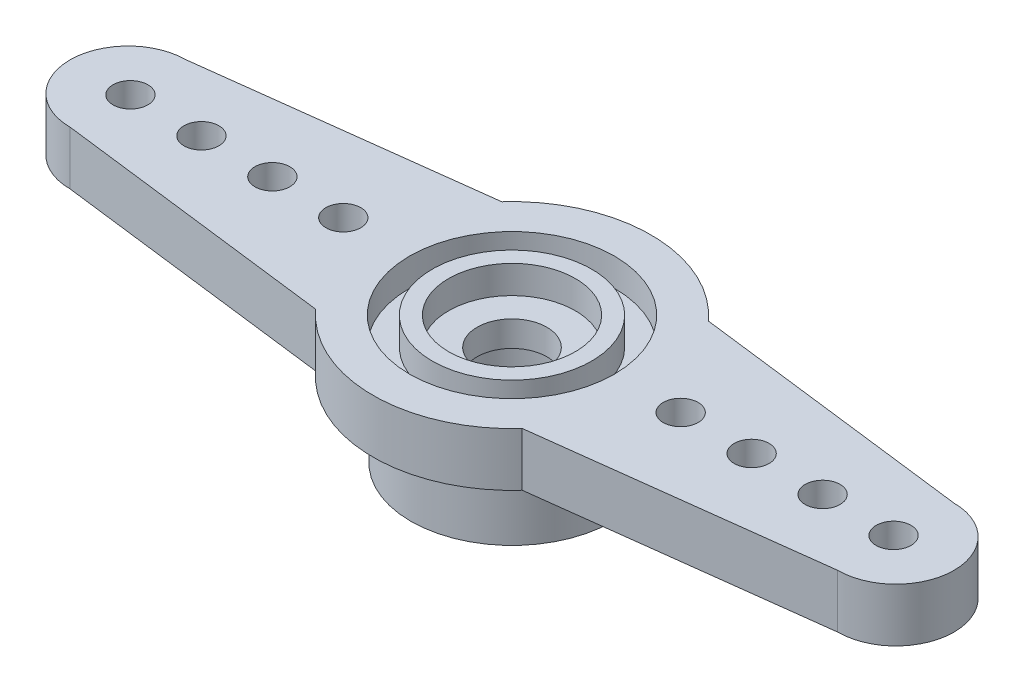
ISO-10303-21;
HEADER;
FILE_DESCRIPTION(('STEP AP214'),'2;1');
FILE_NAME('part.step','',(''),(''),'','','');
FILE_SCHEMA(('AUTOMOTIVE_DESIGN { 1 0 10303 214 1 1 1 1 }'));
ENDSEC;
DATA;
#1=APPLICATION_CONTEXT('core data for automotive mechanical design processes');
#2=APPLICATION_PROTOCOL_DEFINITION('international standard','automotive_design',2000,#1);
#3=PRODUCT_CONTEXT('',#1,'mechanical');
#4=PRODUCT('Part','Part','',(#3));
#5=PRODUCT_RELATED_PRODUCT_CATEGORY('part','',(#4));
#6=PRODUCT_DEFINITION_FORMATION('','',#4);
#7=PRODUCT_DEFINITION_CONTEXT('part definition',#1,'design');
#8=PRODUCT_DEFINITION('design','',#6,#7);
#9=PRODUCT_DEFINITION_SHAPE('','',#8);
#10=(LENGTH_UNIT() NAMED_UNIT(*) SI_UNIT(.MILLI.,.METRE.));
#11=(NAMED_UNIT(*) PLANE_ANGLE_UNIT() SI_UNIT($,.RADIAN.));
#12=(NAMED_UNIT(*) SI_UNIT($,.STERADIAN.) SOLID_ANGLE_UNIT());
#13=UNCERTAINTY_MEASURE_WITH_UNIT(LENGTH_MEASURE(1.E-05),#10,'distance_accuracy_value','');
#14=(GEOMETRIC_REPRESENTATION_CONTEXT(3) GLOBAL_UNCERTAINTY_ASSIGNED_CONTEXT((#13)) GLOBAL_UNIT_ASSIGNED_CONTEXT((#10,
#11,#12)) REPRESENTATION_CONTEXT('',''));
#15=CARTESIAN_POINT('',(0.,0.,0.));
#16=DIRECTION('',(0.,0.,1.));
#17=DIRECTION('',(1.,0.,0.));
#18=AXIS2_PLACEMENT_3D('',#15,#16,#17);
#19=CARTESIAN_POINT('',(0.,2.3,0.));
#20=DIRECTION('',(0.,-1.,0.));
#21=DIRECTION('',(0.,0.,-1.));
#22=AXIS2_PLACEMENT_3D('',#19,#20,#21);
#23=CYLINDRICAL_SURFACE('',#22,1.5);
#24=CARTESIAN_POINT('',(0.,0.,0.));
#25=DIRECTION('',(0.,1.,0.));
#26=DIRECTION('',(0.,0.,1.));
#27=AXIS2_PLACEMENT_3D('',#24,#25,#26);
#28=CIRCLE('',#27,1.5);
#29=CARTESIAN_POINT('',(0.,0.,1.5));
#30=VERTEX_POINT('',#29);
#31=EDGE_CURVE('E145',#30,#30,#28,.T.);
#32=ORIENTED_EDGE('',*,*,#31,.F.);
#33=EDGE_LOOP('',(#32));
#34=FACE_BOUND('',#33,.T.);
#35=CARTESIAN_POINT('',(0.,1.1,0.));
#36=DIRECTION('',(0.,1.,0.));
#37=DIRECTION('',(0.,0.,1.));
#38=AXIS2_PLACEMENT_3D('',#35,#36,#37);
#39=CIRCLE('',#38,1.5);
#40=CARTESIAN_POINT('',(0.,1.1,1.5));
#41=VERTEX_POINT('',#40);
#42=EDGE_CURVE('E269',#41,#41,#39,.F.);
#43=ORIENTED_EDGE('',*,*,#42,.F.);
#44=EDGE_LOOP('',(#43));
#45=FACE_BOUND('',#44,.T.);
#46=ADVANCED_FACE('F42',(#34,#45),#23,.F.);
#47=CARTESIAN_POINT('',(0.,2.3,0.));
#48=DIRECTION('',(0.,1.,0.));
#49=DIRECTION('',(0.,0.,1.));
#50=AXIS2_PLACEMENT_3D('',#47,#48,#49);
#51=PLANE('',#50);
#52=CARTESIAN_POINT('',(0.,2.3,0.));
#53=DIRECTION('',(0.,1.,0.));
#54=DIRECTION('',(0.,0.,1.));
#55=AXIS2_PLACEMENT_3D('',#52,#53,#54);
#56=CIRCLE('',#55,2.725);
#57=CARTESIAN_POINT('',(0.,2.3,2.725));
#58=VERTEX_POINT('',#57);
#59=EDGE_CURVE('E266',#58,#58,#56,.T.);
#60=ORIENTED_EDGE('',*,*,#59,.F.);
#61=EDGE_LOOP('',(#60));
#62=FACE_BOUND('',#61,.T.);
#63=CARTESIAN_POINT('',(0.,2.3,0.));
#64=DIRECTION('',(0.,1.,0.));
#65=DIRECTION('',(0.,0.,1.));
#66=AXIS2_PLACEMENT_3D('',#63,#64,#65);
#67=CIRCLE('',#66,3.425);
#68=CARTESIAN_POINT('',(0.,2.3,3.425));
#69=VERTEX_POINT('',#68);
#70=EDGE_CURVE('E258',#69,#69,#67,.T.);
#71=ORIENTED_EDGE('',*,*,#70,.T.);
#72=EDGE_LOOP('',(#71));
#73=FACE_BOUND('',#72,.T.);
#74=ADVANCED_FACE('F279',(#62,#73),#51,.T.);
#75=CARTESIAN_POINT('',(0.,0.,0.));
#76=DIRECTION('',(0.,1.,0.));
#77=DIRECTION('',(0.,0.,1.));
#78=AXIS2_PLACEMENT_3D('',#75,#76,#77);
#79=PLANE('',#78);
#80=CARTESIAN_POINT('',(7.25,0.,0.));
#81=DIRECTION('',(0.,1.,0.));
#82=DIRECTION('',(0.,0.,1.));
#83=AXIS2_PLACEMENT_3D('',#80,#81,#82);
#84=CIRCLE('',#83,0.75);
#85=CARTESIAN_POINT('',(7.25,0.,0.75));
#86=VERTEX_POINT('',#85);
#87=EDGE_CURVE('E233',#86,#86,#84,.T.);
#88=ORIENTED_EDGE('',*,*,#87,.T.);
#89=EDGE_LOOP('',(#88));
#90=FACE_BOUND('',#89,.T.);
#91=CARTESIAN_POINT('',(-13.35,0.,0.));
#92=DIRECTION('',(0.,1.,0.));
#93=DIRECTION('',(0.,0.,1.));
#94=AXIS2_PLACEMENT_3D('',#91,#92,#93);
#95=CIRCLE('',#94,0.75);
#96=CARTESIAN_POINT('',(-13.35,0.,0.75));
#97=VERTEX_POINT('',#96);
#98=EDGE_CURVE('E221',#97,#97,#95,.T.);
#99=ORIENTED_EDGE('',*,*,#98,.T.);
#100=EDGE_LOOP('',(#99));
#101=FACE_BOUND('',#100,.T.);
#102=CARTESIAN_POINT('',(16.4,0.,0.));
#103=DIRECTION('',(0.,1.,0.));
#104=DIRECTION('',(0.,0.,1.));
#105=AXIS2_PLACEMENT_3D('',#102,#103,#104);
#106=CIRCLE('',#105,0.750000000000002);
#107=CARTESIAN_POINT('',(16.4,0.,0.750000000000002));
#108=VERTEX_POINT('',#107);
#109=EDGE_CURVE('E209',#108,#108,#106,.T.);
#110=ORIENTED_EDGE('',*,*,#109,.T.);
#111=EDGE_LOOP('',(#110));
#112=FACE_BOUND('',#111,.T.);
#113=CARTESIAN_POINT('',(10.3,0.,0.));
#114=DIRECTION('',(0.,1.,0.));
#115=DIRECTION('',(0.,0.,1.));
#116=AXIS2_PLACEMENT_3D('',#113,#114,#115);
#117=CIRCLE('',#116,0.75);
#118=CARTESIAN_POINT('',(10.3,0.,0.75));
#119=VERTEX_POINT('',#118);
#120=EDGE_CURVE('E197',#119,#119,#117,.T.);
#121=ORIENTED_EDGE('',*,*,#120,.T.);
#122=EDGE_LOOP('',(#121));
#123=FACE_BOUND('',#122,.T.);
#124=CARTESIAN_POINT('',(0.,0.,0.));
#125=DIRECTION('',(0.,1.,0.));
#126=DIRECTION('',(0.,0.,1.));
#127=AXIS2_PLACEMENT_3D('',#124,#125,#126);
#128=CIRCLE('',#127,5.975);
#129=CARTESIAN_POINT('',(4.4385386108493,0.,-4.));
#130=VERTEX_POINT('',#129);
#131=CARTESIAN_POINT('',(-4.4385386108493,0.,-4.));
#132=VERTEX_POINT('',#131);
#133=EDGE_CURVE('E141',#130,#132,#128,.T.);
#134=ORIENTED_EDGE('',*,*,#133,.F.);
#135=DIRECTION('',(-0.992355477372928,0.,-0.123412343499133));
#136=VECTOR('',#135,1.);
#137=CARTESIAN_POINT('',(4.4385386108493,0.,-4.));
#138=LINE('',#137,#136);
#139=CARTESIAN_POINT('',(16.5,0.,-2.5));
#140=VERTEX_POINT('',#139);
#141=EDGE_CURVE('E94',#140,#130,#138,.T.);
#142=ORIENTED_EDGE('',*,*,#141,.F.);
#143=CARTESIAN_POINT('',(16.5,0.,0.));
#144=DIRECTION('',(0.,1.,0.));
#145=DIRECTION('',(0.,0.,1.));
#146=AXIS2_PLACEMENT_3D('',#143,#144,#145);
#147=CIRCLE('',#146,2.5);
#148=CARTESIAN_POINT('',(16.5,0.,2.5));
#149=VERTEX_POINT('',#148);
#150=EDGE_CURVE('E88',#149,#140,#147,.T.);
#151=ORIENTED_EDGE('',*,*,#150,.F.);
#152=DIRECTION('',(0.992355477372928,0.,-0.123412343499133));
#153=VECTOR('',#152,1.);
#154=CARTESIAN_POINT('',(4.4385386108493,0.,4.));
#155=LINE('',#154,#153);
#156=CARTESIAN_POINT('',(4.4385386108493,0.,4.));
#157=VERTEX_POINT('',#156);
#158=EDGE_CURVE('E131',#157,#149,#155,.T.);
#159=ORIENTED_EDGE('',*,*,#158,.F.);
#160=CARTESIAN_POINT('',(0.,0.,0.));
#161=DIRECTION('',(0.,1.,0.));
#162=DIRECTION('',(0.,0.,1.));
#163=AXIS2_PLACEMENT_3D('',#160,#161,#162);
#164=CIRCLE('',#163,5.975);
#165=CARTESIAN_POINT('',(-4.43853861084929,0.,4.));
#166=VERTEX_POINT('',#165);
#167=EDGE_CURVE('E151',#166,#157,#164,.T.);
#168=ORIENTED_EDGE('',*,*,#167,.F.);
#169=DIRECTION('',(0.992355477372928,0.,0.123412343499133));
#170=VECTOR('',#169,1.);
#171=CARTESIAN_POINT('',(-16.5,0.,2.5));
#172=LINE('',#171,#170);
#173=CARTESIAN_POINT('',(-16.5,0.,2.5));
#174=VERTEX_POINT('',#173);
#175=EDGE_CURVE('E149',#174,#166,#172,.T.);
#176=ORIENTED_EDGE('',*,*,#175,.F.);
#177=CARTESIAN_POINT('',(-16.5,0.,0.));
#178=DIRECTION('',(0.,1.,0.));
#179=DIRECTION('',(0.,0.,1.));
#180=AXIS2_PLACEMENT_3D('',#177,#178,#179);
#181=CIRCLE('',#180,2.5);
#182=CARTESIAN_POINT('',(-16.5,0.,-2.5));
#183=VERTEX_POINT('',#182);
#184=EDGE_CURVE('E147',#183,#174,#181,.T.);
#185=ORIENTED_EDGE('',*,*,#184,.F.);
#186=DIRECTION('',(-0.992355477372928,0.,0.123412343499133));
#187=VECTOR('',#186,1.);
#188=CARTESIAN_POINT('',(-4.4385386108493,0.,-4.));
#189=LINE('',#188,#187);
#190=EDGE_CURVE('E144',#132,#183,#189,.T.);
#191=ORIENTED_EDGE('',*,*,#190,.F.);
#192=EDGE_LOOP('',(#134,#142,#151,#159,#168,#176,#185,#191));
#193=FACE_BOUND('',#192,.T.);
#194=CARTESIAN_POINT('',(13.35,0.,0.));
#195=DIRECTION('',(0.,1.,0.));
#196=DIRECTION('',(0.,0.,1.));
#197=AXIS2_PLACEMENT_3D('',#194,#195,#196);
#198=CIRCLE('',#197,0.75);
#199=CARTESIAN_POINT('',(13.35,0.,0.75));
#200=VERTEX_POINT('',#199);
#201=EDGE_CURVE('E203',#200,#200,#198,.T.);
#202=ORIENTED_EDGE('',*,*,#201,.T.);
#203=EDGE_LOOP('',(#202));
#204=FACE_BOUND('',#203,.T.);
#205=CARTESIAN_POINT('',(-10.3,0.,0.));
#206=DIRECTION('',(0.,1.,0.));
#207=DIRECTION('',(0.,0.,1.));
#208=AXIS2_PLACEMENT_3D('',#205,#206,#207);
#209=CIRCLE('',#208,0.75);
#210=CARTESIAN_POINT('',(-10.3,0.,0.75));
#211=VERTEX_POINT('',#210);
#212=EDGE_CURVE('E215',#211,#211,#209,.T.);
#213=ORIENTED_EDGE('',*,*,#212,.T.);
#214=EDGE_LOOP('',(#213));
#215=FACE_BOUND('',#214,.T.);
#216=CARTESIAN_POINT('',(-16.4,0.,0.));
#217=DIRECTION('',(0.,1.,0.));
#218=DIRECTION('',(0.,0.,1.));
#219=AXIS2_PLACEMENT_3D('',#216,#217,#218);
#220=CIRCLE('',#219,0.750000000000002);
#221=CARTESIAN_POINT('',(-16.4,0.,0.750000000000004));
#222=VERTEX_POINT('',#221);
#223=EDGE_CURVE('E227',#222,#222,#220,.T.);
#224=ORIENTED_EDGE('',*,*,#223,.T.);
#225=EDGE_LOOP('',(#224));
#226=FACE_BOUND('',#225,.T.);
#227=CARTESIAN_POINT('',(-7.25,0.,0.));
#228=DIRECTION('',(0.,1.,0.));
#229=DIRECTION('',(0.,0.,1.));
#230=AXIS2_PLACEMENT_3D('',#227,#228,#229);
#231=CIRCLE('',#230,0.75);
#232=CARTESIAN_POINT('',(-7.25,0.,0.75));
#233=VERTEX_POINT('',#232);
#234=EDGE_CURVE('E239',#233,#233,#231,.T.);
#235=ORIENTED_EDGE('',*,*,#234,.T.);
#236=EDGE_LOOP('',(#235));
#237=FACE_BOUND('',#236,.T.);
#238=CARTESIAN_POINT('',(0.,0.,0.));
#239=DIRECTION('',(0.,1.,0.));
#240=DIRECTION('',(0.,0.,1.));
#241=AXIS2_PLACEMENT_3D('',#238,#239,#240);
#242=CIRCLE('',#241,4.35);
#243=CARTESIAN_POINT('',(0.,0.,4.35));
#244=VERTEX_POINT('',#243);
#245=EDGE_CURVE('E12',#244,#244,#242,.F.);
#246=ORIENTED_EDGE('',*,*,#245,.F.);
#247=EDGE_LOOP('',(#246));
#248=FACE_BOUND('',#247,.T.);
#249=ADVANCED_FACE('F174',(#90,#101,#112,#123,#193,#204,#215,#226,#237,#248),#79,.F.);
#250=CARTESIAN_POINT('',(0.,2.3,0.));
#251=DIRECTION('',(0.,1.,0.));
#252=DIRECTION('',(0.,0.,1.));
#253=AXIS2_PLACEMENT_3D('',#250,#251,#252);
#254=CIRCLE('',#253,4.4);
#255=CARTESIAN_POINT('',(0.,2.3,4.4));
#256=VERTEX_POINT('',#255);
#257=EDGE_CURVE('E254',#256,#256,#254,.T.);
#258=ORIENTED_EDGE('',*,*,#257,.F.);
#259=EDGE_LOOP('',(#258));
#260=FACE_BOUND('',#259,.T.);
#261=CARTESIAN_POINT('',(7.25,2.3,0.));
#262=DIRECTION('',(0.,1.,0.));
#263=DIRECTION('',(0.,0.,1.));
#264=AXIS2_PLACEMENT_3D('',#261,#262,#263);
#265=CIRCLE('',#264,0.75);
#266=CARTESIAN_POINT('',(7.25,2.3,0.75));
#267=VERTEX_POINT('',#266);
#268=EDGE_CURVE('E230',#267,#267,#265,.T.);
#269=ORIENTED_EDGE('',*,*,#268,.F.);
#270=EDGE_LOOP('',(#269));
#271=FACE_BOUND('',#270,.T.);
#272=CARTESIAN_POINT('',(-13.35,2.3,0.));
#273=DIRECTION('',(0.,1.,0.));
#274=DIRECTION('',(0.,0.,1.));
#275=AXIS2_PLACEMENT_3D('',#272,#273,#274);
#276=CIRCLE('',#275,0.75);
#277=CARTESIAN_POINT('',(-13.35,2.3,0.75));
#278=VERTEX_POINT('',#277);
#279=EDGE_CURVE('E218',#278,#278,#276,.T.);
#280=ORIENTED_EDGE('',*,*,#279,.F.);
#281=EDGE_LOOP('',(#280));
#282=FACE_BOUND('',#281,.T.);
#283=CARTESIAN_POINT('',(16.4,2.3,0.));
#284=DIRECTION('',(0.,1.,0.));
#285=DIRECTION('',(0.,0.,1.));
#286=AXIS2_PLACEMENT_3D('',#283,#284,#285);
#287=CIRCLE('',#286,0.750000000000002);
#288=CARTESIAN_POINT('',(16.4,2.3,0.750000000000002));
#289=VERTEX_POINT('',#288);
#290=EDGE_CURVE('E206',#289,#289,#287,.T.);
#291=ORIENTED_EDGE('',*,*,#290,.F.);
#292=EDGE_LOOP('',(#291));
#293=FACE_BOUND('',#292,.T.);
#294=CARTESIAN_POINT('',(10.3,2.3,0.));
#295=DIRECTION('',(0.,1.,0.));
#296=DIRECTION('',(0.,0.,1.));
#297=AXIS2_PLACEMENT_3D('',#294,#295,#296);
#298=CIRCLE('',#297,0.75);
#299=CARTESIAN_POINT('',(10.3,2.3,0.75));
#300=VERTEX_POINT('',#299);
#301=EDGE_CURVE('E196',#300,#300,#298,.T.);
#302=ORIENTED_EDGE('',*,*,#301,.F.);
#303=EDGE_LOOP('',(#302));
#304=FACE_BOUND('',#303,.T.);
#305=CARTESIAN_POINT('',(0.,2.3,0.));
#306=DIRECTION('',(0.,1.,0.));
#307=DIRECTION('',(0.,0.,1.));
#308=AXIS2_PLACEMENT_3D('',#305,#306,#307);
#309=CIRCLE('',#308,5.975);
#310=CARTESIAN_POINT('',(4.4385386108493,2.3,-4.));
#311=VERTEX_POINT('',#310);
#312=CARTESIAN_POINT('',(-4.4385386108493,2.3,-4.));
#313=VERTEX_POINT('',#312);
#314=EDGE_CURVE('E156',#311,#313,#309,.T.);
#315=ORIENTED_EDGE('',*,*,#314,.T.);
#316=DIRECTION('',(-0.992355477372928,0.,0.123412343499133));
#317=VECTOR('',#316,1.);
#318=CARTESIAN_POINT('',(-4.4385386108493,2.3,-4.));
#319=LINE('',#318,#317);
#320=CARTESIAN_POINT('',(-16.5,2.3,-2.5));
#321=VERTEX_POINT('',#320);
#322=EDGE_CURVE('E103',#313,#321,#319,.T.);
#323=ORIENTED_EDGE('',*,*,#322,.T.);
#324=CARTESIAN_POINT('',(-16.5,2.3,0.));
#325=DIRECTION('',(0.,1.,0.));
#326=DIRECTION('',(0.,0.,1.));
#327=AXIS2_PLACEMENT_3D('',#324,#325,#326);
#328=CIRCLE('',#327,2.5);
#329=CARTESIAN_POINT('',(-16.5,2.3,2.5));
#330=VERTEX_POINT('',#329);
#331=EDGE_CURVE('E188',#321,#330,#328,.T.);
#332=ORIENTED_EDGE('',*,*,#331,.T.);
#333=DIRECTION('',(0.992355477372928,0.,0.123412343499133));
#334=VECTOR('',#333,1.);
#335=CARTESIAN_POINT('',(-16.5,2.3,2.5));
#336=LINE('',#335,#334);
#337=CARTESIAN_POINT('',(-4.43853861084929,2.3,4.));
#338=VERTEX_POINT('',#337);
#339=EDGE_CURVE('E187',#330,#338,#336,.T.);
#340=ORIENTED_EDGE('',*,*,#339,.T.);
#341=CARTESIAN_POINT('',(0.,2.3,0.));
#342=DIRECTION('',(0.,1.,0.));
#343=DIRECTION('',(0.,0.,1.));
#344=AXIS2_PLACEMENT_3D('',#341,#342,#343);
#345=CIRCLE('',#344,5.975);
#346=CARTESIAN_POINT('',(4.4385386108493,2.3,4.));
#347=VERTEX_POINT('',#346);
#348=EDGE_CURVE('E123',#338,#347,#345,.T.);
#349=ORIENTED_EDGE('',*,*,#348,.T.);
#350=DIRECTION('',(0.992355477372928,0.,-0.123412343499133));
#351=VECTOR('',#350,1.);
#352=CARTESIAN_POINT('',(4.4385386108493,2.3,4.));
#353=LINE('',#352,#351);
#354=CARTESIAN_POINT('',(16.5,2.3,2.5));
#355=VERTEX_POINT('',#354);
#356=EDGE_CURVE('E116',#347,#355,#353,.T.);
#357=ORIENTED_EDGE('',*,*,#356,.T.);
#358=CARTESIAN_POINT('',(16.5,2.3,0.));
#359=DIRECTION('',(0.,1.,0.));
#360=DIRECTION('',(0.,0.,1.));
#361=AXIS2_PLACEMENT_3D('',#358,#359,#360);
#362=CIRCLE('',#361,2.5);
#363=CARTESIAN_POINT('',(16.5,2.3,-2.5));
#364=VERTEX_POINT('',#363);
#365=EDGE_CURVE('E121',#355,#364,#362,.T.);
#366=ORIENTED_EDGE('',*,*,#365,.T.);
#367=DIRECTION('',(-0.992355477372928,0.,-0.123412343499133));
#368=VECTOR('',#367,1.);
#369=CARTESIAN_POINT('',(4.4385386108493,2.3,-4.));
#370=LINE('',#369,#368);
#371=EDGE_CURVE('E59',#364,#311,#370,.T.);
#372=ORIENTED_EDGE('',*,*,#371,.T.);
#373=EDGE_LOOP('',(#315,#323,#332,#340,#349,#357,#366,#372));
#374=FACE_BOUND('',#373,.T.);
#375=CARTESIAN_POINT('',(13.35,2.3,0.));
#376=DIRECTION('',(0.,1.,0.));
#377=DIRECTION('',(0.,0.,1.));
#378=AXIS2_PLACEMENT_3D('',#375,#376,#377);
#379=CIRCLE('',#378,0.75);
#380=CARTESIAN_POINT('',(13.35,2.3,0.75));
#381=VERTEX_POINT('',#380);
#382=EDGE_CURVE('E200',#381,#381,#379,.T.);
#383=ORIENTED_EDGE('',*,*,#382,.F.);
#384=EDGE_LOOP('',(#383));
#385=FACE_BOUND('',#384,.T.);
#386=CARTESIAN_POINT('',(-10.3,2.3,0.));
#387=DIRECTION('',(0.,1.,0.));
#388=DIRECTION('',(0.,0.,1.));
#389=AXIS2_PLACEMENT_3D('',#386,#387,#388);
#390=CIRCLE('',#389,0.75);
#391=CARTESIAN_POINT('',(-10.3,2.3,0.75));
#392=VERTEX_POINT('',#391);
#393=EDGE_CURVE('E212',#392,#392,#390,.T.);
#394=ORIENTED_EDGE('',*,*,#393,.F.);
#395=EDGE_LOOP('',(#394));
#396=FACE_BOUND('',#395,.T.);
#397=CARTESIAN_POINT('',(-16.4,2.3,0.));
#398=DIRECTION('',(0.,1.,0.));
#399=DIRECTION('',(0.,0.,1.));
#400=AXIS2_PLACEMENT_3D('',#397,#398,#399);
#401=CIRCLE('',#400,0.750000000000002);
#402=CARTESIAN_POINT('',(-16.4,2.3,0.750000000000004));
#403=VERTEX_POINT('',#402);
#404=EDGE_CURVE('E224',#403,#403,#401,.T.);
#405=ORIENTED_EDGE('',*,*,#404,.F.);
#406=EDGE_LOOP('',(#405));
#407=FACE_BOUND('',#406,.T.);
#408=CARTESIAN_POINT('',(-7.25,2.3,0.));
#409=DIRECTION('',(0.,1.,0.));
#410=DIRECTION('',(0.,0.,1.));
#411=AXIS2_PLACEMENT_3D('',#408,#409,#410);
#412=CIRCLE('',#411,0.75);
#413=CARTESIAN_POINT('',(-7.25,2.3,0.75));
#414=VERTEX_POINT('',#413);
#415=EDGE_CURVE('E236',#414,#414,#412,.T.);
#416=ORIENTED_EDGE('',*,*,#415,.F.);
#417=EDGE_LOOP('',(#416));
#418=FACE_BOUND('',#417,.T.);
#419=ADVANCED_FACE('F118',(#260,#271,#282,#293,#304,#374,#385,#396,#407,#418),#51,.T.);
#420=CARTESIAN_POINT('',(0.,0.,0.));
#421=DIRECTION('',(0.,-1.,0.));
#422=DIRECTION('',(0.,0.,-1.));
#423=AXIS2_PLACEMENT_3D('',#420,#421,#422);
#424=CIRCLE('',#423,2.45);
#425=CARTESIAN_POINT('',(0.,0.,-2.45));
#426=VERTEX_POINT('',#425);
#427=EDGE_CURVE('E248',#426,#426,#424,.T.);
#428=ORIENTED_EDGE('',*,*,#427,.T.);
#429=EDGE_LOOP('',(#428));
#430=FACE_BOUND('',#429,.T.);
#431=ORIENTED_EDGE('',*,*,#31,.T.);
#432=EDGE_LOOP('',(#431));
#433=FACE_BOUND('',#432,.T.);
#434=ADVANCED_FACE('F293',(#430,#433),#79,.F.);
#435=CARTESIAN_POINT('',(0.,2.3,0.));
#436=DIRECTION('',(0.,-1.,0.));
#437=DIRECTION('',(0.,0.,-1.));
#438=AXIS2_PLACEMENT_3D('',#435,#436,#437);
#439=CYLINDRICAL_SURFACE('',#438,5.975);
#440=ORIENTED_EDGE('',*,*,#133,.T.);
#441=DIRECTION('',(0.,-1.,0.));
#442=VECTOR('',#441,1.);
#443=CARTESIAN_POINT('',(-4.4385386108493,2.3,-4.));
#444=LINE('',#443,#442);
#445=EDGE_CURVE('E51',#313,#132,#444,.T.);
#446=ORIENTED_EDGE('',*,*,#445,.F.);
#447=ORIENTED_EDGE('',*,*,#314,.F.);
#448=DIRECTION('',(0.,-1.,0.));
#449=VECTOR('',#448,1.);
#450=CARTESIAN_POINT('',(4.4385386108493,2.3,-4.));
#451=LINE('',#450,#449);
#452=EDGE_CURVE('E137',#311,#130,#451,.T.);
#453=ORIENTED_EDGE('',*,*,#452,.T.);
#454=EDGE_LOOP('',(#440,#446,#447,#453));
#455=FACE_BOUND('',#454,.T.);
#456=ADVANCED_FACE('F44',(#455),#439,.T.);
#457=CARTESIAN_POINT('',(-4.4385386108493,2.3,-4.));
#458=DIRECTION('',(0.123412343499133,0.,0.992355477372928));
#459=DIRECTION('',(0.992355477372928,0.,-0.123412343499133));
#460=AXIS2_PLACEMENT_3D('',#457,#458,#459);
#461=PLANE('',#460);
#462=ORIENTED_EDGE('',*,*,#190,.T.);
#463=DIRECTION('',(0.,-1.,0.));
#464=VECTOR('',#463,1.);
#465=CARTESIAN_POINT('',(-16.5,2.3,-2.5));
#466=LINE('',#465,#464);
#467=EDGE_CURVE('E166',#321,#183,#466,.T.);
#468=ORIENTED_EDGE('',*,*,#467,.F.);
#469=ORIENTED_EDGE('',*,*,#322,.F.);
#470=ORIENTED_EDGE('',*,*,#445,.T.);
#471=EDGE_LOOP('',(#462,#468,#469,#470));
#472=FACE_BOUND('',#471,.T.);
#473=ADVANCED_FACE('F169',(#472),#461,.F.);
#474=CARTESIAN_POINT('',(-16.5,2.3,0.));
#475=DIRECTION('',(0.,-1.,0.));
#476=DIRECTION('',(0.,0.,-1.));
#477=AXIS2_PLACEMENT_3D('',#474,#475,#476);
#478=CYLINDRICAL_SURFACE('',#477,2.5);
#479=ORIENTED_EDGE('',*,*,#184,.T.);
#480=DIRECTION('',(0.,-1.,0.));
#481=VECTOR('',#480,1.);
#482=CARTESIAN_POINT('',(-16.5,2.3,2.5));
#483=LINE('',#482,#481);
#484=EDGE_CURVE('E163',#330,#174,#483,.T.);
#485=ORIENTED_EDGE('',*,*,#484,.F.);
#486=ORIENTED_EDGE('',*,*,#331,.F.);
#487=ORIENTED_EDGE('',*,*,#467,.T.);
#488=EDGE_LOOP('',(#479,#485,#486,#487));
#489=FACE_BOUND('',#488,.T.);
#490=ADVANCED_FACE('F181',(#489),#478,.T.);
#491=CARTESIAN_POINT('',(-16.5,2.3,2.5));
#492=DIRECTION('',(0.123412343499133,0.,-0.992355477372928));
#493=DIRECTION('',(-0.992355477372928,0.,-0.123412343499133));
#494=AXIS2_PLACEMENT_3D('',#491,#492,#493);
#495=PLANE('',#494);
#496=ORIENTED_EDGE('',*,*,#175,.T.);
#497=DIRECTION('',(0.,-1.,0.));
#498=VECTOR('',#497,1.);
#499=CARTESIAN_POINT('',(-4.43853861084929,2.3,4.));
#500=LINE('',#499,#498);
#501=EDGE_CURVE('E160',#338,#166,#500,.T.);
#502=ORIENTED_EDGE('',*,*,#501,.F.);
#503=ORIENTED_EDGE('',*,*,#339,.F.);
#504=ORIENTED_EDGE('',*,*,#484,.T.);
#505=EDGE_LOOP('',(#496,#502,#503,#504));
#506=FACE_BOUND('',#505,.T.);
#507=ADVANCED_FACE('F185',(#506),#495,.F.);
#508=CARTESIAN_POINT('',(0.,2.3,0.));
#509=DIRECTION('',(0.,-1.,0.));
#510=DIRECTION('',(0.,0.,-1.));
#511=AXIS2_PLACEMENT_3D('',#508,#509,#510);
#512=CYLINDRICAL_SURFACE('',#511,5.975);
#513=ORIENTED_EDGE('',*,*,#167,.T.);
#514=DIRECTION('',(0.,-1.,0.));
#515=VECTOR('',#514,1.);
#516=CARTESIAN_POINT('',(4.4385386108493,2.3,4.));
#517=LINE('',#516,#515);
#518=EDGE_CURVE('E132',#347,#157,#517,.T.);
#519=ORIENTED_EDGE('',*,*,#518,.F.);
#520=ORIENTED_EDGE('',*,*,#348,.F.);
#521=ORIENTED_EDGE('',*,*,#501,.T.);
#522=EDGE_LOOP('',(#513,#519,#520,#521));
#523=FACE_BOUND('',#522,.T.);
#524=ADVANCED_FACE('F305',(#523),#512,.T.);
#525=CARTESIAN_POINT('',(4.4385386108493,2.3,4.));
#526=DIRECTION('',(-0.123412343499133,0.,-0.992355477372928));
#527=DIRECTION('',(-0.992355477372928,0.,0.123412343499133));
#528=AXIS2_PLACEMENT_3D('',#525,#526,#527);
#529=PLANE('',#528);
#530=ORIENTED_EDGE('',*,*,#158,.T.);
#531=DIRECTION('',(0.,-1.,0.));
#532=VECTOR('',#531,1.);
#533=CARTESIAN_POINT('',(16.5,2.3,2.5));
#534=LINE('',#533,#532);
#535=EDGE_CURVE('E128',#355,#149,#534,.T.);
#536=ORIENTED_EDGE('',*,*,#535,.F.);
#537=ORIENTED_EDGE('',*,*,#356,.F.);
#538=ORIENTED_EDGE('',*,*,#518,.T.);
#539=EDGE_LOOP('',(#530,#536,#537,#538));
#540=FACE_BOUND('',#539,.T.);
#541=ADVANCED_FACE('F129',(#540),#529,.F.);
#542=CARTESIAN_POINT('',(16.5,2.3,0.));
#543=DIRECTION('',(0.,-1.,0.));
#544=DIRECTION('',(0.,0.,-1.));
#545=AXIS2_PLACEMENT_3D('',#542,#543,#544);
#546=CYLINDRICAL_SURFACE('',#545,2.5);
#547=ORIENTED_EDGE('',*,*,#150,.T.);
#548=DIRECTION('',(0.,-1.,0.));
#549=VECTOR('',#548,1.);
#550=CARTESIAN_POINT('',(16.5,2.3,-2.5));
#551=LINE('',#550,#549);
#552=EDGE_CURVE('E133',#364,#140,#551,.T.);
#553=ORIENTED_EDGE('',*,*,#552,.F.);
#554=ORIENTED_EDGE('',*,*,#365,.F.);
#555=ORIENTED_EDGE('',*,*,#535,.T.);
#556=EDGE_LOOP('',(#547,#553,#554,#555));
#557=FACE_BOUND('',#556,.T.);
#558=ADVANCED_FACE('F135',(#557),#546,.T.);
#559=CARTESIAN_POINT('',(4.4385386108493,2.3,-4.));
#560=DIRECTION('',(-0.123412343499133,0.,0.992355477372928));
#561=DIRECTION('',(0.992355477372928,0.,0.123412343499133));
#562=AXIS2_PLACEMENT_3D('',#559,#560,#561);
#563=PLANE('',#562);
#564=ORIENTED_EDGE('',*,*,#141,.T.);
#565=ORIENTED_EDGE('',*,*,#452,.F.);
#566=ORIENTED_EDGE('',*,*,#371,.F.);
#567=ORIENTED_EDGE('',*,*,#552,.T.);
#568=EDGE_LOOP('',(#564,#565,#566,#567));
#569=FACE_BOUND('',#568,.T.);
#570=ADVANCED_FACE('F298',(#569),#563,.F.);
#571=CARTESIAN_POINT('',(10.3,2.3,0.));
#572=DIRECTION('',(0.,-1.,0.));
#573=DIRECTION('',(0.,0.,-1.));
#574=AXIS2_PLACEMENT_3D('',#571,#572,#573);
#575=CYLINDRICAL_SURFACE('',#574,0.75);
#576=ORIENTED_EDGE('',*,*,#301,.T.);
#577=EDGE_LOOP('',(#576));
#578=FACE_BOUND('',#577,.T.);
#579=ORIENTED_EDGE('',*,*,#120,.F.);
#580=EDGE_LOOP('',(#579));
#581=FACE_BOUND('',#580,.T.);
#582=ADVANCED_FACE('F289',(#578,#581),#575,.F.);
#583=CARTESIAN_POINT('',(13.35,2.3,0.));
#584=DIRECTION('',(0.,-1.,0.));
#585=DIRECTION('',(0.,0.,-1.));
#586=AXIS2_PLACEMENT_3D('',#583,#584,#585);
#587=CYLINDRICAL_SURFACE('',#586,0.75);
#588=ORIENTED_EDGE('',*,*,#382,.T.);
#589=EDGE_LOOP('',(#588));
#590=FACE_BOUND('',#589,.T.);
#591=ORIENTED_EDGE('',*,*,#201,.F.);
#592=EDGE_LOOP('',(#591));
#593=FACE_BOUND('',#592,.T.);
#594=ADVANCED_FACE('F423',(#590,#593),#587,.F.);
#595=CARTESIAN_POINT('',(16.4,2.3,0.));
#596=DIRECTION('',(0.,-1.,0.));
#597=DIRECTION('',(0.,0.,-1.));
#598=AXIS2_PLACEMENT_3D('',#595,#596,#597);
#599=CYLINDRICAL_SURFACE('',#598,0.750000000000002);
#600=ORIENTED_EDGE('',*,*,#290,.T.);
#601=EDGE_LOOP('',(#600));
#602=FACE_BOUND('',#601,.T.);
#603=ORIENTED_EDGE('',*,*,#109,.F.);
#604=EDGE_LOOP('',(#603));
#605=FACE_BOUND('',#604,.T.);
#606=ADVANCED_FACE('F415',(#602,#605),#599,.F.);
#607=CARTESIAN_POINT('',(-10.3,2.3,0.));
#608=DIRECTION('',(0.,-1.,0.));
#609=DIRECTION('',(0.,0.,-1.));
#610=AXIS2_PLACEMENT_3D('',#607,#608,#609);
#611=CYLINDRICAL_SURFACE('',#610,0.75);
#612=ORIENTED_EDGE('',*,*,#393,.T.);
#613=EDGE_LOOP('',(#612));
#614=FACE_BOUND('',#613,.T.);
#615=ORIENTED_EDGE('',*,*,#212,.F.);
#616=EDGE_LOOP('',(#615));
#617=FACE_BOUND('',#616,.T.);
#618=ADVANCED_FACE('F407',(#614,#617),#611,.F.);
#619=CARTESIAN_POINT('',(-13.35,2.3,0.));
#620=DIRECTION('',(0.,-1.,0.));
#621=DIRECTION('',(0.,0.,-1.));
#622=AXIS2_PLACEMENT_3D('',#619,#620,#621);
#623=CYLINDRICAL_SURFACE('',#622,0.75);
#624=ORIENTED_EDGE('',*,*,#279,.T.);
#625=EDGE_LOOP('',(#624));
#626=FACE_BOUND('',#625,.T.);
#627=ORIENTED_EDGE('',*,*,#98,.F.);
#628=EDGE_LOOP('',(#627));
#629=FACE_BOUND('',#628,.T.);
#630=ADVANCED_FACE('F399',(#626,#629),#623,.F.);
#631=CARTESIAN_POINT('',(-16.4,2.3,0.));
#632=DIRECTION('',(0.,-1.,0.));
#633=DIRECTION('',(0.,0.,-1.));
#634=AXIS2_PLACEMENT_3D('',#631,#632,#633);
#635=CYLINDRICAL_SURFACE('',#634,0.750000000000002);
#636=ORIENTED_EDGE('',*,*,#404,.T.);
#637=EDGE_LOOP('',(#636));
#638=FACE_BOUND('',#637,.T.);
#639=ORIENTED_EDGE('',*,*,#223,.F.);
#640=EDGE_LOOP('',(#639));
#641=FACE_BOUND('',#640,.T.);
#642=ADVANCED_FACE('F391',(#638,#641),#635,.F.);
#643=CARTESIAN_POINT('',(7.25,2.3,0.));
#644=DIRECTION('',(0.,-1.,0.));
#645=DIRECTION('',(0.,0.,-1.));
#646=AXIS2_PLACEMENT_3D('',#643,#644,#645);
#647=CYLINDRICAL_SURFACE('',#646,0.75);
#648=ORIENTED_EDGE('',*,*,#268,.T.);
#649=EDGE_LOOP('',(#648));
#650=FACE_BOUND('',#649,.T.);
#651=ORIENTED_EDGE('',*,*,#87,.F.);
#652=EDGE_LOOP('',(#651));
#653=FACE_BOUND('',#652,.T.);
#654=ADVANCED_FACE('F383',(#650,#653),#647,.F.);
#655=CARTESIAN_POINT('',(-7.25,2.3,0.));
#656=DIRECTION('',(0.,-1.,0.));
#657=DIRECTION('',(0.,0.,-1.));
#658=AXIS2_PLACEMENT_3D('',#655,#656,#657);
#659=CYLINDRICAL_SURFACE('',#658,0.75);
#660=ORIENTED_EDGE('',*,*,#415,.T.);
#661=EDGE_LOOP('',(#660));
#662=FACE_BOUND('',#661,.T.);
#663=ORIENTED_EDGE('',*,*,#234,.F.);
#664=EDGE_LOOP('',(#663));
#665=FACE_BOUND('',#664,.T.);
#666=ADVANCED_FACE('F374',(#662,#665),#659,.F.);
#667=CARTESIAN_POINT('',(0.,-3.2,0.));
#668=DIRECTION('',(0.,-1.,0.));
#669=DIRECTION('',(0.,0.,-1.));
#670=AXIS2_PLACEMENT_3D('',#667,#668,#669);
#671=PLANE('',#670);
#672=CARTESIAN_POINT('',(0.,-3.2,0.));
#673=DIRECTION('',(0.,-1.,0.));
#674=DIRECTION('',(0.,0.,-1.));
#675=AXIS2_PLACEMENT_3D('',#672,#673,#674);
#676=CIRCLE('',#675,4.35);
#677=CARTESIAN_POINT('',(0.,-3.2,-4.35));
#678=VERTEX_POINT('',#677);
#679=EDGE_CURVE('E242',#678,#678,#676,.T.);
#680=ORIENTED_EDGE('',*,*,#679,.T.);
#681=EDGE_LOOP('',(#680));
#682=FACE_BOUND('',#681,.T.);
#683=CARTESIAN_POINT('',(0.,-3.2,0.));
#684=DIRECTION('',(0.,-1.,0.));
#685=DIRECTION('',(0.,0.,-1.));
#686=AXIS2_PLACEMENT_3D('',#683,#684,#685);
#687=CIRCLE('',#686,2.45);
#688=CARTESIAN_POINT('',(0.,-3.2,-2.45));
#689=VERTEX_POINT('',#688);
#690=EDGE_CURVE('E247',#689,#689,#687,.T.);
#691=ORIENTED_EDGE('',*,*,#690,.F.);
#692=EDGE_LOOP('',(#691));
#693=FACE_BOUND('',#692,.T.);
#694=ADVANCED_FACE('F365',(#682,#693),#671,.T.);
#695=CARTESIAN_POINT('',(0.,-3.2,0.));
#696=DIRECTION('',(0.,1.,0.));
#697=DIRECTION('',(0.,0.,1.));
#698=AXIS2_PLACEMENT_3D('',#695,#696,#697);
#699=CYLINDRICAL_SURFACE('',#698,4.35);
#700=ORIENTED_EDGE('',*,*,#679,.F.);
#701=EDGE_LOOP('',(#700));
#702=FACE_BOUND('',#701,.T.);
#703=ORIENTED_EDGE('',*,*,#245,.T.);
#704=EDGE_LOOP('',(#703));
#705=FACE_BOUND('',#704,.T.);
#706=ADVANCED_FACE('F355',(#702,#705),#699,.T.);
#707=CARTESIAN_POINT('',(0.,-3.2,0.));
#708=DIRECTION('',(0.,1.,0.));
#709=DIRECTION('',(0.,0.,1.));
#710=AXIS2_PLACEMENT_3D('',#707,#708,#709);
#711=CYLINDRICAL_SURFACE('',#710,2.45);
#712=ORIENTED_EDGE('',*,*,#690,.T.);
#713=EDGE_LOOP('',(#712));
#714=FACE_BOUND('',#713,.T.);
#715=ORIENTED_EDGE('',*,*,#427,.F.);
#716=EDGE_LOOP('',(#715));
#717=FACE_BOUND('',#716,.T.);
#718=ADVANCED_FACE('F350',(#714,#717),#711,.F.);
#719=CARTESIAN_POINT('',(0.,1.1,0.));
#720=DIRECTION('',(0.,1.,0.));
#721=DIRECTION('',(0.,0.,1.));
#722=AXIS2_PLACEMENT_3D('',#719,#720,#721);
#723=CYLINDRICAL_SURFACE('',#722,3.425);
#724=CARTESIAN_POINT('',(0.,1.1,0.));
#725=DIRECTION('',(0.,1.,0.));
#726=DIRECTION('',(0.,0.,1.));
#727=AXIS2_PLACEMENT_3D('',#724,#725,#726);
#728=CIRCLE('',#727,3.425);
#729=CARTESIAN_POINT('',(0.,1.1,3.425));
#730=VERTEX_POINT('',#729);
#731=EDGE_CURVE('E257',#730,#730,#728,.T.);
#732=ORIENTED_EDGE('',*,*,#731,.T.);
#733=EDGE_LOOP('',(#732));
#734=FACE_BOUND('',#733,.T.);
#735=ORIENTED_EDGE('',*,*,#70,.F.);
#736=EDGE_LOOP('',(#735));
#737=FACE_BOUND('',#736,.T.);
#738=ADVANCED_FACE('F354',(#734,#737),#723,.T.);
#739=CARTESIAN_POINT('',(0.,1.1,0.));
#740=DIRECTION('',(0.,1.,0.));
#741=DIRECTION('',(0.,0.,1.));
#742=AXIS2_PLACEMENT_3D('',#739,#740,#741);
#743=CYLINDRICAL_SURFACE('',#742,4.4);
#744=CARTESIAN_POINT('',(0.,1.1,0.));
#745=DIRECTION('',(0.,1.,0.));
#746=DIRECTION('',(0.,0.,1.));
#747=AXIS2_PLACEMENT_3D('',#744,#745,#746);
#748=CIRCLE('',#747,4.4);
#749=CARTESIAN_POINT('',(0.,1.1,4.4));
#750=VERTEX_POINT('',#749);
#751=EDGE_CURVE('E251',#750,#750,#748,.T.);
#752=ORIENTED_EDGE('',*,*,#751,.F.);
#753=EDGE_LOOP('',(#752));
#754=FACE_BOUND('',#753,.T.);
#755=ORIENTED_EDGE('',*,*,#257,.T.);
#756=EDGE_LOOP('',(#755));
#757=FACE_BOUND('',#756,.T.);
#758=ADVANCED_FACE('F511',(#754,#757),#743,.F.);
#759=CARTESIAN_POINT('',(0.,1.1,0.));
#760=DIRECTION('',(0.,1.,0.));
#761=DIRECTION('',(0.,0.,1.));
#762=AXIS2_PLACEMENT_3D('',#759,#760,#761);
#763=PLANE('',#762);
#764=ORIENTED_EDGE('',*,*,#731,.F.);
#765=EDGE_LOOP('',(#764));
#766=FACE_BOUND('',#765,.T.);
#767=ORIENTED_EDGE('',*,*,#751,.T.);
#768=EDGE_LOOP('',(#767));
#769=FACE_BOUND('',#768,.T.);
#770=ADVANCED_FACE('F515',(#766,#769),#763,.T.);
#771=CARTESIAN_POINT('',(0.,1.1,0.));
#772=DIRECTION('',(0.,1.,0.));
#773=DIRECTION('',(0.,0.,1.));
#774=AXIS2_PLACEMENT_3D('',#771,#772,#773);
#775=CYLINDRICAL_SURFACE('',#774,2.725);
#776=CARTESIAN_POINT('',(0.,1.1,0.));
#777=DIRECTION('',(0.,1.,0.));
#778=DIRECTION('',(0.,0.,1.));
#779=AXIS2_PLACEMENT_3D('',#776,#777,#778);
#780=CIRCLE('',#779,2.725);
#781=CARTESIAN_POINT('',(0.,1.1,2.725));
#782=VERTEX_POINT('',#781);
#783=EDGE_CURVE('E261',#782,#782,#780,.T.);
#784=ORIENTED_EDGE('',*,*,#783,.F.);
#785=EDGE_LOOP('',(#784));
#786=FACE_BOUND('',#785,.T.);
#787=ORIENTED_EDGE('',*,*,#59,.T.);
#788=EDGE_LOOP('',(#787));
#789=FACE_BOUND('',#788,.T.);
#790=ADVANCED_FACE('F519',(#786,#789),#775,.F.);
#791=CARTESIAN_POINT('',(0.,1.1,0.));
#792=DIRECTION('',(0.,1.,0.));
#793=DIRECTION('',(0.,0.,1.));
#794=AXIS2_PLACEMENT_3D('',#791,#792,#793);
#795=PLANE('',#794);
#796=ORIENTED_EDGE('',*,*,#42,.T.);
#797=EDGE_LOOP('',(#796));
#798=FACE_BOUND('',#797,.T.);
#799=ORIENTED_EDGE('',*,*,#783,.T.);
#800=EDGE_LOOP('',(#799));
#801=FACE_BOUND('',#800,.T.);
#802=ADVANCED_FACE('F275',(#798,#801),#795,.T.);
#803=CLOSED_SHELL('',(#46,#74,#249,#419,#434,#456,#473,#490,#507,#524,#541,#558,#570,#582,#594,
#606,#618,#630,#642,#654,#666,#694,#706,#718,#738,#758,#770,#790,#802));
#804=MANIFOLD_SOLID_BREP('B2',#803);
#805=ADVANCED_BREP_SHAPE_REPRESENTATION('',(#18,#804),#14);
#806=SHAPE_DEFINITION_REPRESENTATION(#9,#805);
ENDSEC;
END-ISO-10303-21;
